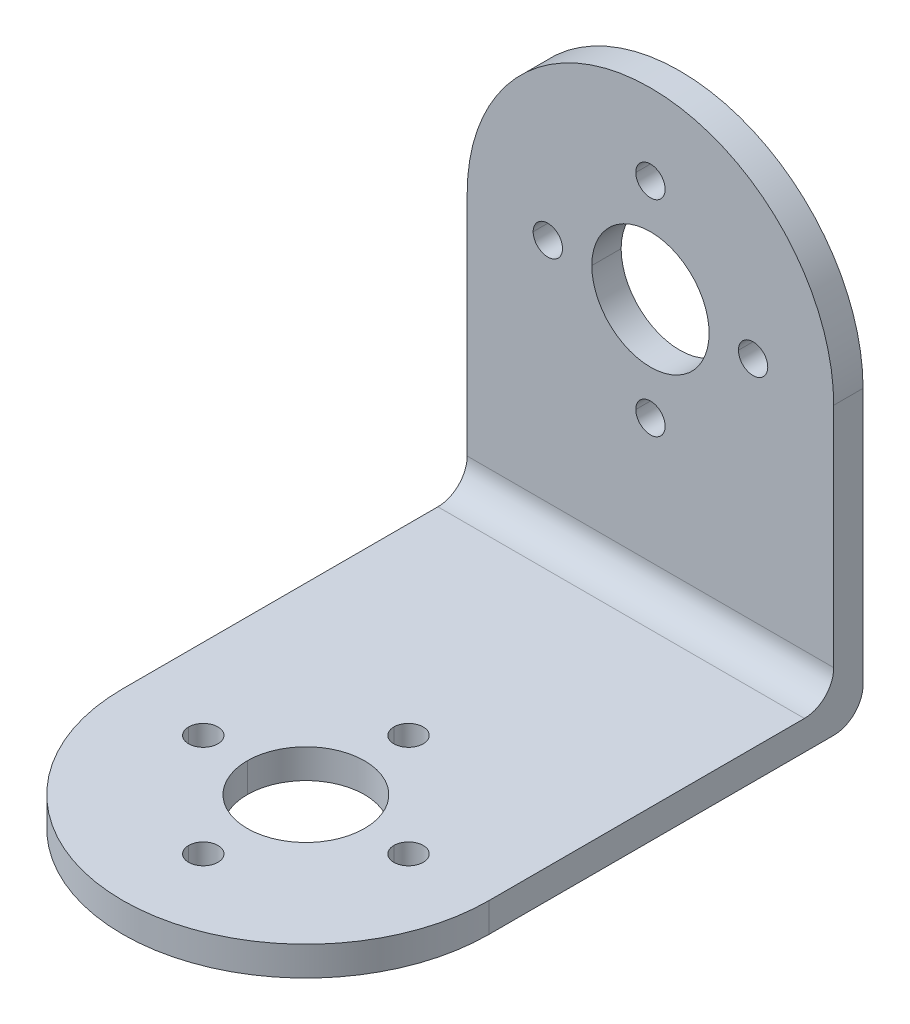
ISO-10303-21;
HEADER;
FILE_DESCRIPTION(('STEP AP214'),'2;1');
FILE_NAME('part.step','',(''),(''),'','','');
FILE_SCHEMA(('AUTOMOTIVE_DESIGN { 1 0 10303 214 1 1 1 1 }'));
ENDSEC;
DATA;
#1=APPLICATION_CONTEXT('core data for automotive mechanical design processes');
#2=APPLICATION_PROTOCOL_DEFINITION('international standard','automotive_design',2000,#1);
#3=PRODUCT_CONTEXT('',#1,'mechanical');
#4=PRODUCT('Part','Part','',(#3));
#5=PRODUCT_RELATED_PRODUCT_CATEGORY('part','',(#4));
#6=PRODUCT_DEFINITION_FORMATION('','',#4);
#7=PRODUCT_DEFINITION_CONTEXT('part definition',#1,'design');
#8=PRODUCT_DEFINITION('design','',#6,#7);
#9=PRODUCT_DEFINITION_SHAPE('','',#8);
#10=(LENGTH_UNIT() NAMED_UNIT(*) SI_UNIT(.MILLI.,.METRE.));
#11=(NAMED_UNIT(*) PLANE_ANGLE_UNIT() SI_UNIT($,.RADIAN.));
#12=(NAMED_UNIT(*) SI_UNIT($,.STERADIAN.) SOLID_ANGLE_UNIT());
#13=UNCERTAINTY_MEASURE_WITH_UNIT(LENGTH_MEASURE(1.E-05),#10,'distance_accuracy_value','');
#14=(GEOMETRIC_REPRESENTATION_CONTEXT(3) GLOBAL_UNCERTAINTY_ASSIGNED_CONTEXT((#13)) GLOBAL_UNIT_ASSIGNED_CONTEXT((#10,
#11,#12)) REPRESENTATION_CONTEXT('',''));
#15=CARTESIAN_POINT('',(0.,0.,0.));
#16=DIRECTION('',(0.,0.,1.));
#17=DIRECTION('',(1.,0.,0.));
#18=AXIS2_PLACEMENT_3D('',#15,#16,#17);
#19=CARTESIAN_POINT('',(0.,2.,2.));
#20=DIRECTION('',(1.,0.,0.));
#21=DIRECTION('',(0.,-1.,0.));
#22=AXIS2_PLACEMENT_3D('',#19,#20,#21);
#23=CYLINDRICAL_SURFACE('',#22,2.);
#24=CARTESIAN_POINT('',(-12.5,2.,2.));
#25=DIRECTION('',(1.,0.,0.));
#26=DIRECTION('',(0.,0.,1.));
#27=AXIS2_PLACEMENT_3D('',#24,#25,#26);
#28=CIRCLE('',#27,2.);
#29=CARTESIAN_POINT('',(-12.5,0.,2.));
#30=VERTEX_POINT('',#29);
#31=CARTESIAN_POINT('',(-12.5,2.,0.));
#32=VERTEX_POINT('',#31);
#33=EDGE_CURVE('E10',#30,#32,#28,.T.);
#34=ORIENTED_EDGE('',*,*,#33,.T.);
#35=DIRECTION('',(-1.,0.,0.));
#36=VECTOR('',#35,1.);
#37=CARTESIAN_POINT('',(0.,2.,0.));
#38=LINE('',#37,#36);
#39=CARTESIAN_POINT('',(12.5,2.,0.));
#40=VERTEX_POINT('',#39);
#41=EDGE_CURVE('E152',#40,#32,#38,.T.);
#42=ORIENTED_EDGE('',*,*,#41,.F.);
#43=CARTESIAN_POINT('',(12.5,2.,2.));
#44=DIRECTION('',(-1.,0.,0.));
#45=DIRECTION('',(0.,0.,-1.));
#46=AXIS2_PLACEMENT_3D('',#43,#44,#45);
#47=CIRCLE('',#46,2.);
#48=CARTESIAN_POINT('',(12.5,0.,2.));
#49=VERTEX_POINT('',#48);
#50=EDGE_CURVE('E20',#40,#49,#47,.T.);
#51=ORIENTED_EDGE('',*,*,#50,.T.);
#52=DIRECTION('',(-1.,0.,0.));
#53=VECTOR('',#52,1.);
#54=CARTESIAN_POINT('',(0.,0.,2.));
#55=LINE('',#54,#53);
#56=EDGE_CURVE('E151',#49,#30,#55,.T.);
#57=ORIENTED_EDGE('',*,*,#56,.T.);
#58=EDGE_LOOP('',(#34,#42,#51,#57));
#59=FACE_BOUND('',#58,.T.);
#60=ADVANCED_FACE('F17',(#59),#23,.T.);
#61=CARTESIAN_POINT('',(-12.5,0.,0.));
#62=DIRECTION('',(-1.,0.,0.));
#63=DIRECTION('',(0.,0.,1.));
#64=AXIS2_PLACEMENT_3D('',#61,#62,#63);
#65=PLANE('',#64);
#66=DIRECTION('',(0.,0.,1.));
#67=VECTOR('',#66,1.);
#68=CARTESIAN_POINT('',(-12.5,0.,13.75));
#69=LINE('',#68,#67);
#70=CARTESIAN_POINT('',(-12.5,0.,25.5));
#71=VERTEX_POINT('',#70);
#72=EDGE_CURVE('E168',#30,#71,#69,.T.);
#73=ORIENTED_EDGE('',*,*,#72,.T.);
#74=DIRECTION('',(0.,1.,0.));
#75=VECTOR('',#74,1.);
#76=CARTESIAN_POINT('',(-12.5,1.,25.5));
#77=LINE('',#76,#75);
#78=CARTESIAN_POINT('',(-12.5,2.,25.5));
#79=VERTEX_POINT('',#78);
#80=EDGE_CURVE('E336',#71,#79,#77,.T.);
#81=ORIENTED_EDGE('',*,*,#80,.T.);
#82=DIRECTION('',(0.,0.,1.));
#83=VECTOR('',#82,1.);
#84=CARTESIAN_POINT('',(-12.5,2.,14.75));
#85=LINE('',#84,#83);
#86=CARTESIAN_POINT('',(-12.5,2.,4.));
#87=VERTEX_POINT('',#86);
#88=EDGE_CURVE('E409',#87,#79,#85,.T.);
#89=ORIENTED_EDGE('',*,*,#88,.F.);
#90=CARTESIAN_POINT('',(-12.5,4.,4.));
#91=DIRECTION('',(1.,0.,0.));
#92=DIRECTION('',(0.,0.,1.));
#93=AXIS2_PLACEMENT_3D('',#90,#91,#92);
#94=CIRCLE('',#93,2.);
#95=CARTESIAN_POINT('',(-12.5,4.,2.));
#96=VERTEX_POINT('',#95);
#97=EDGE_CURVE('E175',#87,#96,#94,.T.);
#98=ORIENTED_EDGE('',*,*,#97,.T.);
#99=DIRECTION('',(0.,1.,0.));
#100=VECTOR('',#99,1.);
#101=CARTESIAN_POINT('',(-12.5,11.75,2.));
#102=LINE('',#101,#100);
#103=CARTESIAN_POINT('',(-12.5,19.5,2.));
#104=VERTEX_POINT('',#103);
#105=EDGE_CURVE('E406',#96,#104,#102,.T.);
#106=ORIENTED_EDGE('',*,*,#105,.T.);
#107=DIRECTION('',(0.,0.,-1.));
#108=VECTOR('',#107,1.);
#109=CARTESIAN_POINT('',(-12.5,19.5,1.));
#110=LINE('',#109,#108);
#111=CARTESIAN_POINT('',(-12.5,19.5,0.));
#112=VERTEX_POINT('',#111);
#113=EDGE_CURVE('E203',#104,#112,#110,.T.);
#114=ORIENTED_EDGE('',*,*,#113,.T.);
#115=DIRECTION('',(0.,1.,0.));
#116=VECTOR('',#115,1.);
#117=CARTESIAN_POINT('',(-12.5,10.75,0.));
#118=LINE('',#117,#116);
#119=EDGE_CURVE('E187',#32,#112,#118,.T.);
#120=ORIENTED_EDGE('',*,*,#119,.F.);
#121=ORIENTED_EDGE('',*,*,#33,.F.);
#122=EDGE_LOOP('',(#73,#81,#89,#98,#106,#114,#120,#121));
#123=FACE_BOUND('',#122,.T.);
#124=ADVANCED_FACE('F201',(#123),#65,.T.);
#125=CARTESIAN_POINT('',(12.5,0.,25.5));
#126=DIRECTION('',(1.,0.,0.));
#127=DIRECTION('',(0.,0.,-1.));
#128=AXIS2_PLACEMENT_3D('',#125,#126,#127);
#129=PLANE('',#128);
#130=DIRECTION('',(0.,1.,0.));
#131=VECTOR('',#130,1.);
#132=CARTESIAN_POINT('',(12.5,10.75,0.));
#133=LINE('',#132,#131);
#134=CARTESIAN_POINT('',(12.5,19.5,0.));
#135=VERTEX_POINT('',#134);
#136=EDGE_CURVE('E188',#40,#135,#133,.T.);
#137=ORIENTED_EDGE('',*,*,#136,.T.);
#138=DIRECTION('',(0.,0.,-1.));
#139=VECTOR('',#138,1.);
#140=CARTESIAN_POINT('',(12.5,19.5,1.));
#141=LINE('',#140,#139);
#142=CARTESIAN_POINT('',(12.5,19.5,2.));
#143=VERTEX_POINT('',#142);
#144=EDGE_CURVE('E249',#143,#135,#141,.T.);
#145=ORIENTED_EDGE('',*,*,#144,.F.);
#146=DIRECTION('',(0.,1.,0.));
#147=VECTOR('',#146,1.);
#148=CARTESIAN_POINT('',(12.5,11.75,2.));
#149=LINE('',#148,#147);
#150=CARTESIAN_POINT('',(12.5,4.,2.));
#151=VERTEX_POINT('',#150);
#152=EDGE_CURVE('E248',#151,#143,#149,.T.);
#153=ORIENTED_EDGE('',*,*,#152,.F.);
#154=CARTESIAN_POINT('',(12.5,4.,4.));
#155=DIRECTION('',(-1.,0.,0.));
#156=DIRECTION('',(0.,0.,-1.));
#157=AXIS2_PLACEMENT_3D('',#154,#155,#156);
#158=CIRCLE('',#157,2.);
#159=CARTESIAN_POINT('',(12.5,2.,4.));
#160=VERTEX_POINT('',#159);
#161=EDGE_CURVE('E181',#151,#160,#158,.T.);
#162=ORIENTED_EDGE('',*,*,#161,.T.);
#163=DIRECTION('',(0.,0.,-1.));
#164=VECTOR('',#163,1.);
#165=CARTESIAN_POINT('',(12.5,2.,14.75));
#166=LINE('',#165,#164);
#167=CARTESIAN_POINT('',(12.5,2.,25.5));
#168=VERTEX_POINT('',#167);
#169=EDGE_CURVE('E265',#168,#160,#166,.T.);
#170=ORIENTED_EDGE('',*,*,#169,.F.);
#171=DIRECTION('',(0.,1.,0.));
#172=VECTOR('',#171,1.);
#173=CARTESIAN_POINT('',(12.5,1.,25.5));
#174=LINE('',#173,#172);
#175=CARTESIAN_POINT('',(12.5,0.,25.5));
#176=VERTEX_POINT('',#175);
#177=EDGE_CURVE('E163',#176,#168,#174,.T.);
#178=ORIENTED_EDGE('',*,*,#177,.F.);
#179=DIRECTION('',(0.,0.,-1.));
#180=VECTOR('',#179,1.);
#181=CARTESIAN_POINT('',(12.5,0.,13.75));
#182=LINE('',#181,#180);
#183=EDGE_CURVE('E157',#176,#49,#182,.T.);
#184=ORIENTED_EDGE('',*,*,#183,.T.);
#185=ORIENTED_EDGE('',*,*,#50,.F.);
#186=EDGE_LOOP('',(#137,#145,#153,#162,#170,#178,#184,#185));
#187=FACE_BOUND('',#186,.T.);
#188=ADVANCED_FACE('F159',(#187),#129,.T.);
#189=CARTESIAN_POINT('',(12.5,0.,0.));
#190=DIRECTION('',(0.,0.,-1.));
#191=DIRECTION('',(-1.,0.,0.));
#192=AXIS2_PLACEMENT_3D('',#189,#190,#191);
#193=PLANE('',#192);
#194=CARTESIAN_POINT('',(0.,19.5,0.));
#195=DIRECTION('',(0.,0.,-1.));
#196=DIRECTION('',(-1.,0.,0.));
#197=AXIS2_PLACEMENT_3D('',#194,#195,#196);
#198=CIRCLE('',#197,4.);
#199=CARTESIAN_POINT('',(-4.,19.5,0.));
#200=VERTEX_POINT('',#199);
#201=CARTESIAN_POINT('',(4.,19.5,0.));
#202=VERTEX_POINT('',#201);
#203=EDGE_CURVE('E367',#200,#202,#198,.T.);
#204=ORIENTED_EDGE('',*,*,#203,.F.);
#205=CARTESIAN_POINT('',(0.,19.5,0.));
#206=DIRECTION('',(0.,0.,-1.));
#207=DIRECTION('',(-1.,0.,0.));
#208=AXIS2_PLACEMENT_3D('',#205,#206,#207);
#209=CIRCLE('',#208,4.);
#210=EDGE_CURVE('E341',#202,#200,#209,.T.);
#211=ORIENTED_EDGE('',*,*,#210,.F.);
#212=EDGE_LOOP('',(#204,#211));
#213=FACE_BOUND('',#212,.T.);
#214=CARTESIAN_POINT('',(0.,26.5,0.));
#215=DIRECTION('',(0.,0.,-1.));
#216=DIRECTION('',(-1.,0.,0.));
#217=AXIS2_PLACEMENT_3D('',#214,#215,#216);
#218=CIRCLE('',#217,1.);
#219=CARTESIAN_POINT('',(-1.,26.5,0.));
#220=VERTEX_POINT('',#219);
#221=CARTESIAN_POINT('',(1.,26.5,0.));
#222=VERTEX_POINT('',#221);
#223=EDGE_CURVE('E283',#220,#222,#218,.T.);
#224=ORIENTED_EDGE('',*,*,#223,.F.);
#225=CARTESIAN_POINT('',(0.,26.5,0.));
#226=DIRECTION('',(0.,0.,-1.));
#227=DIRECTION('',(-1.,0.,0.));
#228=AXIS2_PLACEMENT_3D('',#225,#226,#227);
#229=CIRCLE('',#228,1.);
#230=EDGE_CURVE('E375',#222,#220,#229,.T.);
#231=ORIENTED_EDGE('',*,*,#230,.F.);
#232=EDGE_LOOP('',(#224,#231));
#233=FACE_BOUND('',#232,.T.);
#234=CARTESIAN_POINT('',(7.,19.5,0.));
#235=DIRECTION('',(0.,0.,-1.));
#236=DIRECTION('',(-1.,0.,0.));
#237=AXIS2_PLACEMENT_3D('',#234,#235,#236);
#238=CIRCLE('',#237,1.);
#239=CARTESIAN_POINT('',(6.,19.5,0.));
#240=VERTEX_POINT('',#239);
#241=CARTESIAN_POINT('',(8.,19.5,0.));
#242=VERTEX_POINT('',#241);
#243=EDGE_CURVE('E405',#240,#242,#238,.T.);
#244=ORIENTED_EDGE('',*,*,#243,.F.);
#245=CARTESIAN_POINT('',(7.,19.5,0.));
#246=DIRECTION('',(0.,0.,-1.));
#247=DIRECTION('',(-1.,0.,0.));
#248=AXIS2_PLACEMENT_3D('',#245,#246,#247);
#249=CIRCLE('',#248,1.);
#250=EDGE_CURVE('E323',#242,#240,#249,.T.);
#251=ORIENTED_EDGE('',*,*,#250,.F.);
#252=EDGE_LOOP('',(#244,#251));
#253=FACE_BOUND('',#252,.T.);
#254=CARTESIAN_POINT('',(-7.,19.5,0.));
#255=DIRECTION('',(0.,0.,-1.));
#256=DIRECTION('',(-1.,0.,0.));
#257=AXIS2_PLACEMENT_3D('',#254,#255,#256);
#258=CIRCLE('',#257,1.);
#259=CARTESIAN_POINT('',(-8.,19.5,0.));
#260=VERTEX_POINT('',#259);
#261=CARTESIAN_POINT('',(-6.,19.5,0.));
#262=VERTEX_POINT('',#261);
#263=EDGE_CURVE('E348',#260,#262,#258,.T.);
#264=ORIENTED_EDGE('',*,*,#263,.F.);
#265=CARTESIAN_POINT('',(-7.,19.5,0.));
#266=DIRECTION('',(0.,0.,-1.));
#267=DIRECTION('',(-1.,0.,0.));
#268=AXIS2_PLACEMENT_3D('',#265,#266,#267);
#269=CIRCLE('',#268,1.);
#270=EDGE_CURVE('E234',#262,#260,#269,.T.);
#271=ORIENTED_EDGE('',*,*,#270,.F.);
#272=EDGE_LOOP('',(#264,#271));
#273=FACE_BOUND('',#272,.T.);
#274=CARTESIAN_POINT('',(0.,12.5,0.));
#275=DIRECTION('',(0.,0.,-1.));
#276=DIRECTION('',(-1.,0.,0.));
#277=AXIS2_PLACEMENT_3D('',#274,#275,#276);
#278=CIRCLE('',#277,1.);
#279=CARTESIAN_POINT('',(-1.,12.5,0.));
#280=VERTEX_POINT('',#279);
#281=CARTESIAN_POINT('',(1.,12.5,0.));
#282=VERTEX_POINT('',#281);
#283=EDGE_CURVE('E440',#280,#282,#278,.T.);
#284=ORIENTED_EDGE('',*,*,#283,.F.);
#285=CARTESIAN_POINT('',(0.,12.5,0.));
#286=DIRECTION('',(0.,0.,-1.));
#287=DIRECTION('',(-1.,0.,0.));
#288=AXIS2_PLACEMENT_3D('',#285,#286,#287);
#289=CIRCLE('',#288,1.);
#290=EDGE_CURVE('E309',#282,#280,#289,.T.);
#291=ORIENTED_EDGE('',*,*,#290,.F.);
#292=EDGE_LOOP('',(#284,#291));
#293=FACE_BOUND('',#292,.T.);
#294=ORIENTED_EDGE('',*,*,#119,.T.);
#295=CARTESIAN_POINT('',(0.,19.5,0.));
#296=DIRECTION('',(0.,0.,-1.));
#297=DIRECTION('',(-1.,0.,0.));
#298=AXIS2_PLACEMENT_3D('',#295,#296,#297);
#299=CIRCLE('',#298,12.5);
#300=EDGE_CURVE('E421',#112,#135,#299,.T.);
#301=ORIENTED_EDGE('',*,*,#300,.T.);
#302=ORIENTED_EDGE('',*,*,#136,.F.);
#303=ORIENTED_EDGE('',*,*,#41,.T.);
#304=EDGE_LOOP('',(#294,#301,#302,#303));
#305=FACE_BOUND('',#304,.T.);
#306=ADVANCED_FACE('F196',(#213,#233,#253,#273,#293,#305),#193,.T.);
#307=CARTESIAN_POINT('',(0.,0.,0.));
#308=DIRECTION('',(0.,1.,0.));
#309=DIRECTION('',(-1.,0.,0.));
#310=AXIS2_PLACEMENT_3D('',#307,#308,#309);
#311=PLANE('',#310);
#312=CARTESIAN_POINT('',(0.,0.,32.5));
#313=DIRECTION('',(0.,1.,0.));
#314=DIRECTION('',(-1.,0.,0.));
#315=AXIS2_PLACEMENT_3D('',#312,#313,#314);
#316=CIRCLE('',#315,1.);
#317=CARTESIAN_POINT('',(-1.,0.,32.5));
#318=VERTEX_POINT('',#317);
#319=CARTESIAN_POINT('',(1.,0.,32.5));
#320=VERTEX_POINT('',#319);
#321=EDGE_CURVE('E620',#318,#320,#316,.T.);
#322=ORIENTED_EDGE('',*,*,#321,.T.);
#323=CARTESIAN_POINT('',(0.,0.,32.5));
#324=DIRECTION('',(0.,1.,0.));
#325=DIRECTION('',(-1.,0.,0.));
#326=AXIS2_PLACEMENT_3D('',#323,#324,#325);
#327=CIRCLE('',#326,1.);
#328=EDGE_CURVE('E217',#320,#318,#327,.T.);
#329=ORIENTED_EDGE('',*,*,#328,.T.);
#330=EDGE_LOOP('',(#322,#329));
#331=FACE_BOUND('',#330,.T.);
#332=CARTESIAN_POINT('',(0.,0.,18.5));
#333=DIRECTION('',(0.,1.,0.));
#334=DIRECTION('',(-1.,0.,0.));
#335=AXIS2_PLACEMENT_3D('',#332,#333,#334);
#336=CIRCLE('',#335,1.);
#337=CARTESIAN_POINT('',(-1.,0.,18.5));
#338=VERTEX_POINT('',#337);
#339=CARTESIAN_POINT('',(1.,0.,18.5));
#340=VERTEX_POINT('',#339);
#341=EDGE_CURVE('E211',#338,#340,#336,.T.);
#342=ORIENTED_EDGE('',*,*,#341,.T.);
#343=CARTESIAN_POINT('',(0.,0.,18.5));
#344=DIRECTION('',(0.,1.,0.));
#345=DIRECTION('',(-1.,0.,0.));
#346=AXIS2_PLACEMENT_3D('',#343,#344,#345);
#347=CIRCLE('',#346,1.);
#348=EDGE_CURVE('E254',#340,#338,#347,.T.);
#349=ORIENTED_EDGE('',*,*,#348,.T.);
#350=EDGE_LOOP('',(#342,#349));
#351=FACE_BOUND('',#350,.T.);
#352=CARTESIAN_POINT('',(7.,0.,25.5));
#353=DIRECTION('',(0.,1.,0.));
#354=DIRECTION('',(-1.,0.,0.));
#355=AXIS2_PLACEMENT_3D('',#352,#353,#354);
#356=CIRCLE('',#355,1.);
#357=CARTESIAN_POINT('',(6.,0.,25.5));
#358=VERTEX_POINT('',#357);
#359=CARTESIAN_POINT('',(8.,0.,25.5));
#360=VERTEX_POINT('',#359);
#361=EDGE_CURVE('E226',#358,#360,#356,.T.);
#362=ORIENTED_EDGE('',*,*,#361,.T.);
#363=CARTESIAN_POINT('',(7.,0.,25.5));
#364=DIRECTION('',(0.,1.,0.));
#365=DIRECTION('',(-1.,0.,0.));
#366=AXIS2_PLACEMENT_3D('',#363,#364,#365);
#367=CIRCLE('',#366,1.);
#368=EDGE_CURVE('E270',#360,#358,#367,.T.);
#369=ORIENTED_EDGE('',*,*,#368,.T.);
#370=EDGE_LOOP('',(#362,#369));
#371=FACE_BOUND('',#370,.T.);
#372=CARTESIAN_POINT('',(-7.,0.,25.5));
#373=DIRECTION('',(0.,1.,0.));
#374=DIRECTION('',(-1.,0.,0.));
#375=AXIS2_PLACEMENT_3D('',#372,#373,#374);
#376=CIRCLE('',#375,1.);
#377=CARTESIAN_POINT('',(-8.,0.,25.5));
#378=VERTEX_POINT('',#377);
#379=CARTESIAN_POINT('',(-6.,0.,25.5));
#380=VERTEX_POINT('',#379);
#381=EDGE_CURVE('E282',#378,#380,#376,.T.);
#382=ORIENTED_EDGE('',*,*,#381,.T.);
#383=CARTESIAN_POINT('',(-7.,0.,25.5));
#384=DIRECTION('',(0.,1.,0.));
#385=DIRECTION('',(-1.,0.,0.));
#386=AXIS2_PLACEMENT_3D('',#383,#384,#385);
#387=CIRCLE('',#386,1.);
#388=EDGE_CURVE('E299',#380,#378,#387,.T.);
#389=ORIENTED_EDGE('',*,*,#388,.T.);
#390=EDGE_LOOP('',(#382,#389));
#391=FACE_BOUND('',#390,.T.);
#392=CARTESIAN_POINT('',(0.,0.,25.5));
#393=DIRECTION('',(0.,1.,0.));
#394=DIRECTION('',(-1.,0.,0.));
#395=AXIS2_PLACEMENT_3D('',#392,#393,#394);
#396=CIRCLE('',#395,4.);
#397=CARTESIAN_POINT('',(-4.,0.,25.5));
#398=VERTEX_POINT('',#397);
#399=CARTESIAN_POINT('',(4.,0.,25.5));
#400=VERTEX_POINT('',#399);
#401=EDGE_CURVE('E319',#398,#400,#396,.T.);
#402=ORIENTED_EDGE('',*,*,#401,.T.);
#403=CARTESIAN_POINT('',(0.,0.,25.5));
#404=DIRECTION('',(0.,1.,0.));
#405=DIRECTION('',(-1.,0.,0.));
#406=AXIS2_PLACEMENT_3D('',#403,#404,#405);
#407=CIRCLE('',#406,4.);
#408=EDGE_CURVE('E332',#400,#398,#407,.T.);
#409=ORIENTED_EDGE('',*,*,#408,.T.);
#410=EDGE_LOOP('',(#402,#409));
#411=FACE_BOUND('',#410,.T.);
#412=ORIENTED_EDGE('',*,*,#56,.F.);
#413=ORIENTED_EDGE('',*,*,#183,.F.);
#414=CARTESIAN_POINT('',(0.,0.,25.5));
#415=DIRECTION('',(0.,1.,0.));
#416=DIRECTION('',(-1.,0.,0.));
#417=AXIS2_PLACEMENT_3D('',#414,#415,#416);
#418=CIRCLE('',#417,12.5);
#419=EDGE_CURVE('E345',#71,#176,#418,.T.);
#420=ORIENTED_EDGE('',*,*,#419,.F.);
#421=ORIENTED_EDGE('',*,*,#72,.F.);
#422=EDGE_LOOP('',(#412,#413,#420,#421));
#423=FACE_BOUND('',#422,.T.);
#424=ADVANCED_FACE('F172',(#331,#351,#371,#391,#411,#423),#311,.F.);
#425=CARTESIAN_POINT('',(0.,4.,4.));
#426=DIRECTION('',(1.,0.,0.));
#427=DIRECTION('',(0.,-1.,0.));
#428=AXIS2_PLACEMENT_3D('',#425,#426,#427);
#429=CYLINDRICAL_SURFACE('',#428,2.);
#430=DIRECTION('',(-1.,0.,0.));
#431=VECTOR('',#430,1.);
#432=CARTESIAN_POINT('',(0.,2.,4.));
#433=LINE('',#432,#431);
#434=EDGE_CURVE('E261',#160,#87,#433,.T.);
#435=ORIENTED_EDGE('',*,*,#434,.F.);
#436=ORIENTED_EDGE('',*,*,#161,.F.);
#437=DIRECTION('',(-1.,0.,0.));
#438=VECTOR('',#437,1.);
#439=CARTESIAN_POINT('',(0.,4.,2.));
#440=LINE('',#439,#438);
#441=EDGE_CURVE('E244',#151,#96,#440,.T.);
#442=ORIENTED_EDGE('',*,*,#441,.T.);
#443=ORIENTED_EDGE('',*,*,#97,.F.);
#444=EDGE_LOOP('',(#435,#436,#442,#443));
#445=FACE_BOUND('',#444,.T.);
#446=ADVANCED_FACE('F589',(#445),#429,.F.);
#447=CARTESIAN_POINT('',(0.,2.,0.));
#448=DIRECTION('',(0.,1.,0.));
#449=DIRECTION('',(-1.,0.,0.));
#450=AXIS2_PLACEMENT_3D('',#447,#448,#449);
#451=PLANE('',#450);
#452=CARTESIAN_POINT('',(0.,2.,32.5));
#453=DIRECTION('',(0.,1.,0.));
#454=DIRECTION('',(-1.,0.,0.));
#455=AXIS2_PLACEMENT_3D('',#452,#453,#454);
#456=CIRCLE('',#455,1.);
#457=CARTESIAN_POINT('',(1.,2.,32.5));
#458=VERTEX_POINT('',#457);
#459=CARTESIAN_POINT('',(-1.,2.,32.5));
#460=VERTEX_POINT('',#459);
#461=EDGE_CURVE('E213',#458,#460,#456,.T.);
#462=ORIENTED_EDGE('',*,*,#461,.F.);
#463=CARTESIAN_POINT('',(0.,2.,32.5));
#464=DIRECTION('',(0.,1.,0.));
#465=DIRECTION('',(-1.,0.,0.));
#466=AXIS2_PLACEMENT_3D('',#463,#464,#465);
#467=CIRCLE('',#466,1.);
#468=EDGE_CURVE('E611',#460,#458,#467,.T.);
#469=ORIENTED_EDGE('',*,*,#468,.F.);
#470=EDGE_LOOP('',(#462,#469));
#471=FACE_BOUND('',#470,.T.);
#472=CARTESIAN_POINT('',(0.,2.,18.5));
#473=DIRECTION('',(0.,1.,0.));
#474=DIRECTION('',(-1.,0.,0.));
#475=AXIS2_PLACEMENT_3D('',#472,#473,#474);
#476=CIRCLE('',#475,1.);
#477=CARTESIAN_POINT('',(1.,2.,18.5));
#478=VERTEX_POINT('',#477);
#479=CARTESIAN_POINT('',(-1.,2.,18.5));
#480=VERTEX_POINT('',#479);
#481=EDGE_CURVE('E233',#478,#480,#476,.T.);
#482=ORIENTED_EDGE('',*,*,#481,.F.);
#483=CARTESIAN_POINT('',(0.,2.,18.5));
#484=DIRECTION('',(0.,1.,0.));
#485=DIRECTION('',(-1.,0.,0.));
#486=AXIS2_PLACEMENT_3D('',#483,#484,#485);
#487=CIRCLE('',#486,1.);
#488=EDGE_CURVE('E222',#480,#478,#487,.T.);
#489=ORIENTED_EDGE('',*,*,#488,.F.);
#490=EDGE_LOOP('',(#482,#489));
#491=FACE_BOUND('',#490,.T.);
#492=CARTESIAN_POINT('',(7.,2.,25.5));
#493=DIRECTION('',(0.,1.,0.));
#494=DIRECTION('',(-1.,0.,0.));
#495=AXIS2_PLACEMENT_3D('',#492,#493,#494);
#496=CIRCLE('',#495,1.);
#497=CARTESIAN_POINT('',(8.,2.,25.5));
#498=VERTEX_POINT('',#497);
#499=CARTESIAN_POINT('',(6.,2.,25.5));
#500=VERTEX_POINT('',#499);
#501=EDGE_CURVE('E266',#498,#500,#496,.T.);
#502=ORIENTED_EDGE('',*,*,#501,.F.);
#503=CARTESIAN_POINT('',(7.,2.,25.5));
#504=DIRECTION('',(0.,1.,0.));
#505=DIRECTION('',(-1.,0.,0.));
#506=AXIS2_PLACEMENT_3D('',#503,#504,#505);
#507=CIRCLE('',#506,1.);
#508=EDGE_CURVE('E227',#500,#498,#507,.T.);
#509=ORIENTED_EDGE('',*,*,#508,.F.);
#510=EDGE_LOOP('',(#502,#509));
#511=FACE_BOUND('',#510,.T.);
#512=CARTESIAN_POINT('',(-7.,2.,25.5));
#513=DIRECTION('',(0.,1.,0.));
#514=DIRECTION('',(-1.,0.,0.));
#515=AXIS2_PLACEMENT_3D('',#512,#513,#514);
#516=CIRCLE('',#515,1.);
#517=CARTESIAN_POINT('',(-6.,2.,25.5));
#518=VERTEX_POINT('',#517);
#519=CARTESIAN_POINT('',(-8.,2.,25.5));
#520=VERTEX_POINT('',#519);
#521=EDGE_CURVE('E295',#518,#520,#516,.T.);
#522=ORIENTED_EDGE('',*,*,#521,.F.);
#523=CARTESIAN_POINT('',(-7.,2.,25.5));
#524=DIRECTION('',(0.,1.,0.));
#525=DIRECTION('',(-1.,0.,0.));
#526=AXIS2_PLACEMENT_3D('',#523,#524,#525);
#527=CIRCLE('',#526,1.);
#528=EDGE_CURVE('E274',#520,#518,#527,.T.);
#529=ORIENTED_EDGE('',*,*,#528,.F.);
#530=EDGE_LOOP('',(#522,#529));
#531=FACE_BOUND('',#530,.T.);
#532=CARTESIAN_POINT('',(0.,2.,25.5));
#533=DIRECTION('',(0.,1.,0.));
#534=DIRECTION('',(-1.,0.,0.));
#535=AXIS2_PLACEMENT_3D('',#532,#533,#534);
#536=CIRCLE('',#535,4.);
#537=CARTESIAN_POINT('',(4.,2.,25.5));
#538=VERTEX_POINT('',#537);
#539=CARTESIAN_POINT('',(-4.,2.,25.5));
#540=VERTEX_POINT('',#539);
#541=EDGE_CURVE('E328',#538,#540,#536,.T.);
#542=ORIENTED_EDGE('',*,*,#541,.F.);
#543=CARTESIAN_POINT('',(0.,2.,25.5));
#544=DIRECTION('',(0.,1.,0.));
#545=DIRECTION('',(-1.,0.,0.));
#546=AXIS2_PLACEMENT_3D('',#543,#544,#545);
#547=CIRCLE('',#546,4.);
#548=EDGE_CURVE('E303',#540,#538,#547,.T.);
#549=ORIENTED_EDGE('',*,*,#548,.F.);
#550=EDGE_LOOP('',(#542,#549));
#551=FACE_BOUND('',#550,.T.);
#552=ORIENTED_EDGE('',*,*,#88,.T.);
#553=CARTESIAN_POINT('',(0.,2.,25.5));
#554=DIRECTION('',(0.,1.,0.));
#555=DIRECTION('',(-1.,0.,0.));
#556=AXIS2_PLACEMENT_3D('',#553,#554,#555);
#557=CIRCLE('',#556,12.5);
#558=EDGE_CURVE('E337',#79,#168,#557,.T.);
#559=ORIENTED_EDGE('',*,*,#558,.T.);
#560=ORIENTED_EDGE('',*,*,#169,.T.);
#561=ORIENTED_EDGE('',*,*,#434,.T.);
#562=EDGE_LOOP('',(#552,#559,#560,#561));
#563=FACE_BOUND('',#562,.T.);
#564=ADVANCED_FACE('F464',(#471,#491,#511,#531,#551,#563),#451,.T.);
#565=CARTESIAN_POINT('',(12.5,2.,2.));
#566=DIRECTION('',(0.,0.,-1.));
#567=DIRECTION('',(-1.,0.,0.));
#568=AXIS2_PLACEMENT_3D('',#565,#566,#567);
#569=PLANE('',#568);
#570=CARTESIAN_POINT('',(0.,19.5,2.));
#571=DIRECTION('',(0.,0.,1.));
#572=DIRECTION('',(1.,0.,0.));
#573=AXIS2_PLACEMENT_3D('',#570,#571,#572);
#574=CIRCLE('',#573,4.);
#575=CARTESIAN_POINT('',(-4.,19.5,2.));
#576=VERTEX_POINT('',#575);
#577=CARTESIAN_POINT('',(4.,19.5,2.));
#578=VERTEX_POINT('',#577);
#579=EDGE_CURVE('E359',#576,#578,#574,.T.);
#580=ORIENTED_EDGE('',*,*,#579,.F.);
#581=CARTESIAN_POINT('',(0.,19.5,2.));
#582=DIRECTION('',(0.,0.,1.));
#583=DIRECTION('',(1.,0.,0.));
#584=AXIS2_PLACEMENT_3D('',#581,#582,#583);
#585=CIRCLE('',#584,4.);
#586=EDGE_CURVE('E371',#578,#576,#585,.T.);
#587=ORIENTED_EDGE('',*,*,#586,.F.);
#588=EDGE_LOOP('',(#580,#587));
#589=FACE_BOUND('',#588,.T.);
#590=CARTESIAN_POINT('',(0.,26.5,2.));
#591=DIRECTION('',(0.,0.,1.));
#592=DIRECTION('',(1.,0.,0.));
#593=AXIS2_PLACEMENT_3D('',#590,#591,#592);
#594=CIRCLE('',#593,1.);
#595=CARTESIAN_POINT('',(-1.,26.5,2.));
#596=VERTEX_POINT('',#595);
#597=CARTESIAN_POINT('',(1.,26.5,2.));
#598=VERTEX_POINT('',#597);
#599=EDGE_CURVE('E383',#596,#598,#594,.T.);
#600=ORIENTED_EDGE('',*,*,#599,.F.);
#601=CARTESIAN_POINT('',(0.,26.5,2.));
#602=DIRECTION('',(0.,0.,1.));
#603=DIRECTION('',(1.,0.,0.));
#604=AXIS2_PLACEMENT_3D('',#601,#602,#603);
#605=CIRCLE('',#604,1.);
#606=EDGE_CURVE('E286',#598,#596,#605,.T.);
#607=ORIENTED_EDGE('',*,*,#606,.F.);
#608=EDGE_LOOP('',(#600,#607));
#609=FACE_BOUND('',#608,.T.);
#610=CARTESIAN_POINT('',(7.,19.5,2.));
#611=DIRECTION('',(0.,0.,1.));
#612=DIRECTION('',(1.,0.,0.));
#613=AXIS2_PLACEMENT_3D('',#610,#611,#612);
#614=CIRCLE('',#613,1.);
#615=CARTESIAN_POINT('',(6.,19.5,2.));
#616=VERTEX_POINT('',#615);
#617=CARTESIAN_POINT('',(8.,19.5,2.));
#618=VERTEX_POINT('',#617);
#619=EDGE_CURVE('E397',#616,#618,#614,.T.);
#620=ORIENTED_EDGE('',*,*,#619,.F.);
#621=CARTESIAN_POINT('',(7.,19.5,2.));
#622=DIRECTION('',(0.,0.,1.));
#623=DIRECTION('',(1.,0.,0.));
#624=AXIS2_PLACEMENT_3D('',#621,#622,#623);
#625=CIRCLE('',#624,1.);
#626=EDGE_CURVE('E239',#618,#616,#625,.T.);
#627=ORIENTED_EDGE('',*,*,#626,.F.);
#628=EDGE_LOOP('',(#620,#627));
#629=FACE_BOUND('',#628,.T.);
#630=CARTESIAN_POINT('',(-7.,19.5,2.));
#631=DIRECTION('',(0.,0.,1.));
#632=DIRECTION('',(1.,0.,0.));
#633=AXIS2_PLACEMENT_3D('',#630,#631,#632);
#634=CIRCLE('',#633,1.);
#635=CARTESIAN_POINT('',(-8.,19.5,2.));
#636=VERTEX_POINT('',#635);
#637=CARTESIAN_POINT('',(-6.,19.5,2.));
#638=VERTEX_POINT('',#637);
#639=EDGE_CURVE('E417',#636,#638,#634,.T.);
#640=ORIENTED_EDGE('',*,*,#639,.F.);
#641=CARTESIAN_POINT('',(-7.,19.5,2.));
#642=DIRECTION('',(0.,0.,1.));
#643=DIRECTION('',(1.,0.,0.));
#644=AXIS2_PLACEMENT_3D('',#641,#642,#643);
#645=CIRCLE('',#644,1.);
#646=EDGE_CURVE('E351',#638,#636,#645,.T.);
#647=ORIENTED_EDGE('',*,*,#646,.F.);
#648=EDGE_LOOP('',(#640,#647));
#649=FACE_BOUND('',#648,.T.);
#650=CARTESIAN_POINT('',(0.,12.5,2.));
#651=DIRECTION('',(0.,0.,1.));
#652=DIRECTION('',(1.,0.,0.));
#653=AXIS2_PLACEMENT_3D('',#650,#651,#652);
#654=CIRCLE('',#653,1.);
#655=CARTESIAN_POINT('',(-1.,12.5,2.));
#656=VERTEX_POINT('',#655);
#657=CARTESIAN_POINT('',(1.,12.5,2.));
#658=VERTEX_POINT('',#657);
#659=EDGE_CURVE('E308',#656,#658,#654,.T.);
#660=ORIENTED_EDGE('',*,*,#659,.F.);
#661=CARTESIAN_POINT('',(0.,12.5,2.));
#662=DIRECTION('',(0.,0.,1.));
#663=DIRECTION('',(1.,0.,0.));
#664=AXIS2_PLACEMENT_3D('',#661,#662,#663);
#665=CIRCLE('',#664,1.);
#666=EDGE_CURVE('E424',#658,#656,#665,.T.);
#667=ORIENTED_EDGE('',*,*,#666,.F.);
#668=EDGE_LOOP('',(#660,#667));
#669=FACE_BOUND('',#668,.T.);
#670=ORIENTED_EDGE('',*,*,#441,.F.);
#671=ORIENTED_EDGE('',*,*,#152,.T.);
#672=CARTESIAN_POINT('',(0.,19.5,2.));
#673=DIRECTION('',(0.,0.,-1.));
#674=DIRECTION('',(1.,0.,0.));
#675=AXIS2_PLACEMENT_3D('',#672,#673,#674);
#676=CIRCLE('',#675,12.5);
#677=EDGE_CURVE('E447',#104,#143,#676,.T.);
#678=ORIENTED_EDGE('',*,*,#677,.F.);
#679=ORIENTED_EDGE('',*,*,#105,.F.);
#680=EDGE_LOOP('',(#670,#671,#678,#679));
#681=FACE_BOUND('',#680,.T.);
#682=ADVANCED_FACE('F588',(#589,#609,#629,#649,#669,#681),#569,.F.);
#683=CARTESIAN_POINT('',(0.,19.5,0.339999999774993));
#684=DIRECTION('',(0.,0.,-1.));
#685=DIRECTION('',(1.,0.,0.));
#686=AXIS2_PLACEMENT_3D('',#683,#684,#685);
#687=CYLINDRICAL_SURFACE('',#686,12.5);
#688=ORIENTED_EDGE('',*,*,#300,.F.);
#689=ORIENTED_EDGE('',*,*,#113,.F.);
#690=ORIENTED_EDGE('',*,*,#677,.T.);
#691=ORIENTED_EDGE('',*,*,#144,.T.);
#692=EDGE_LOOP('',(#688,#689,#690,#691));
#693=FACE_BOUND('',#692,.T.);
#694=ADVANCED_FACE('F1277',(#693),#687,.T.);
#695=CARTESIAN_POINT('',(0.,12.5,0.339999999774993));
#696=DIRECTION('',(0.,0.,-1.));
#697=DIRECTION('',(1.,0.,0.));
#698=AXIS2_PLACEMENT_3D('',#695,#696,#697);
#699=CYLINDRICAL_SURFACE('',#698,1.);
#700=ORIENTED_EDGE('',*,*,#283,.T.);
#701=DIRECTION('',(0.,0.,-1.));
#702=VECTOR('',#701,1.);
#703=CARTESIAN_POINT('',(1.,12.5,0.339999999774993));
#704=LINE('',#703,#702);
#705=EDGE_CURVE('E436',#658,#282,#704,.T.);
#706=ORIENTED_EDGE('',*,*,#705,.F.);
#707=ORIENTED_EDGE('',*,*,#666,.T.);
#708=DIRECTION('',(0.,0.,-1.));
#709=VECTOR('',#708,1.);
#710=CARTESIAN_POINT('',(-1.,12.5,0.339999999774993));
#711=LINE('',#710,#709);
#712=EDGE_CURVE('E304',#656,#280,#711,.T.);
#713=ORIENTED_EDGE('',*,*,#712,.T.);
#714=EDGE_LOOP('',(#700,#706,#707,#713));
#715=FACE_BOUND('',#714,.T.);
#716=ADVANCED_FACE('F1265',(#715),#699,.F.);
#717=CARTESIAN_POINT('',(0.,12.5,0.339999999774993));
#718=DIRECTION('',(0.,0.,-1.));
#719=DIRECTION('',(1.,0.,0.));
#720=AXIS2_PLACEMENT_3D('',#717,#718,#719);
#721=CYLINDRICAL_SURFACE('',#720,1.);
#722=ORIENTED_EDGE('',*,*,#290,.T.);
#723=ORIENTED_EDGE('',*,*,#712,.F.);
#724=ORIENTED_EDGE('',*,*,#659,.T.);
#725=ORIENTED_EDGE('',*,*,#705,.T.);
#726=EDGE_LOOP('',(#722,#723,#724,#725));
#727=FACE_BOUND('',#726,.T.);
#728=ADVANCED_FACE('F1253',(#727),#721,.F.);
#729=CARTESIAN_POINT('',(-7.,19.5,0.339999999774993));
#730=DIRECTION('',(0.,0.,-1.));
#731=DIRECTION('',(1.,0.,0.));
#732=AXIS2_PLACEMENT_3D('',#729,#730,#731);
#733=CYLINDRICAL_SURFACE('',#732,1.);
#734=ORIENTED_EDGE('',*,*,#263,.T.);
#735=DIRECTION('',(0.,0.,-1.));
#736=VECTOR('',#735,1.);
#737=CARTESIAN_POINT('',(-6.,19.5,0.339999999774993));
#738=LINE('',#737,#736);
#739=EDGE_CURVE('E352',#638,#262,#738,.T.);
#740=ORIENTED_EDGE('',*,*,#739,.F.);
#741=ORIENTED_EDGE('',*,*,#646,.T.);
#742=DIRECTION('',(0.,0.,-1.));
#743=VECTOR('',#742,1.);
#744=CARTESIAN_POINT('',(-8.,19.5,0.339999999774993));
#745=LINE('',#744,#743);
#746=EDGE_CURVE('E238',#636,#260,#745,.T.);
#747=ORIENTED_EDGE('',*,*,#746,.T.);
#748=EDGE_LOOP('',(#734,#740,#741,#747));
#749=FACE_BOUND('',#748,.T.);
#750=ADVANCED_FACE('F1241',(#749),#733,.F.);
#751=CARTESIAN_POINT('',(-7.,19.5,0.339999999774993));
#752=DIRECTION('',(0.,0.,-1.));
#753=DIRECTION('',(1.,0.,0.));
#754=AXIS2_PLACEMENT_3D('',#751,#752,#753);
#755=CYLINDRICAL_SURFACE('',#754,1.);
#756=ORIENTED_EDGE('',*,*,#270,.T.);
#757=ORIENTED_EDGE('',*,*,#746,.F.);
#758=ORIENTED_EDGE('',*,*,#639,.T.);
#759=ORIENTED_EDGE('',*,*,#739,.T.);
#760=EDGE_LOOP('',(#756,#757,#758,#759));
#761=FACE_BOUND('',#760,.T.);
#762=ADVANCED_FACE('F1229',(#761),#755,.F.);
#763=CARTESIAN_POINT('',(7.,19.5,0.339999999774993));
#764=DIRECTION('',(0.,0.,-1.));
#765=DIRECTION('',(1.,0.,0.));
#766=AXIS2_PLACEMENT_3D('',#763,#764,#765);
#767=CYLINDRICAL_SURFACE('',#766,1.);
#768=ORIENTED_EDGE('',*,*,#243,.T.);
#769=DIRECTION('',(0.,0.,-1.));
#770=VECTOR('',#769,1.);
#771=CARTESIAN_POINT('',(8.,19.5,0.339999999774993));
#772=LINE('',#771,#770);
#773=EDGE_CURVE('E401',#618,#242,#772,.T.);
#774=ORIENTED_EDGE('',*,*,#773,.F.);
#775=ORIENTED_EDGE('',*,*,#626,.T.);
#776=DIRECTION('',(0.,0.,-1.));
#777=VECTOR('',#776,1.);
#778=CARTESIAN_POINT('',(6.,19.5,0.339999999774993));
#779=LINE('',#778,#777);
#780=EDGE_CURVE('E393',#616,#240,#779,.T.);
#781=ORIENTED_EDGE('',*,*,#780,.T.);
#782=EDGE_LOOP('',(#768,#774,#775,#781));
#783=FACE_BOUND('',#782,.T.);
#784=ADVANCED_FACE('F1133',(#783),#767,.F.);
#785=CARTESIAN_POINT('',(7.,19.5,0.339999999774993));
#786=DIRECTION('',(0.,0.,-1.));
#787=DIRECTION('',(1.,0.,0.));
#788=AXIS2_PLACEMENT_3D('',#785,#786,#787);
#789=CYLINDRICAL_SURFACE('',#788,1.);
#790=ORIENTED_EDGE('',*,*,#250,.T.);
#791=ORIENTED_EDGE('',*,*,#780,.F.);
#792=ORIENTED_EDGE('',*,*,#619,.T.);
#793=ORIENTED_EDGE('',*,*,#773,.T.);
#794=EDGE_LOOP('',(#790,#791,#792,#793));
#795=FACE_BOUND('',#794,.T.);
#796=ADVANCED_FACE('F1127',(#795),#789,.F.);
#797=CARTESIAN_POINT('',(0.,26.5,0.339999999774993));
#798=DIRECTION('',(0.,0.,-1.));
#799=DIRECTION('',(1.,0.,0.));
#800=AXIS2_PLACEMENT_3D('',#797,#798,#799);
#801=CYLINDRICAL_SURFACE('',#800,1.);
#802=ORIENTED_EDGE('',*,*,#223,.T.);
#803=DIRECTION('',(0.,0.,-1.));
#804=VECTOR('',#803,1.);
#805=CARTESIAN_POINT('',(1.,26.5,0.339999999774993));
#806=LINE('',#805,#804);
#807=EDGE_CURVE('E287',#598,#222,#806,.T.);
#808=ORIENTED_EDGE('',*,*,#807,.F.);
#809=ORIENTED_EDGE('',*,*,#606,.T.);
#810=DIRECTION('',(0.,0.,-1.));
#811=VECTOR('',#810,1.);
#812=CARTESIAN_POINT('',(-1.,26.5,0.339999999774993));
#813=LINE('',#812,#811);
#814=EDGE_CURVE('E379',#596,#220,#813,.T.);
#815=ORIENTED_EDGE('',*,*,#814,.T.);
#816=EDGE_LOOP('',(#802,#808,#809,#815));
#817=FACE_BOUND('',#816,.T.);
#818=ADVANCED_FACE('F1132',(#817),#801,.F.);
#819=CARTESIAN_POINT('',(0.,26.5,0.339999999774993));
#820=DIRECTION('',(0.,0.,-1.));
#821=DIRECTION('',(1.,0.,0.));
#822=AXIS2_PLACEMENT_3D('',#819,#820,#821);
#823=CYLINDRICAL_SURFACE('',#822,1.);
#824=ORIENTED_EDGE('',*,*,#230,.T.);
#825=ORIENTED_EDGE('',*,*,#814,.F.);
#826=ORIENTED_EDGE('',*,*,#599,.T.);
#827=ORIENTED_EDGE('',*,*,#807,.T.);
#828=EDGE_LOOP('',(#824,#825,#826,#827));
#829=FACE_BOUND('',#828,.T.);
#830=ADVANCED_FACE('F1194',(#829),#823,.F.);
#831=CARTESIAN_POINT('',(0.,19.5,0.339999999774993));
#832=DIRECTION('',(0.,0.,-1.));
#833=DIRECTION('',(1.,0.,0.));
#834=AXIS2_PLACEMENT_3D('',#831,#832,#833);
#835=CYLINDRICAL_SURFACE('',#834,4.);
#836=ORIENTED_EDGE('',*,*,#203,.T.);
#837=DIRECTION('',(0.,0.,-1.));
#838=VECTOR('',#837,1.);
#839=CARTESIAN_POINT('',(4.,19.5,0.339999999774993));
#840=LINE('',#839,#838);
#841=EDGE_CURVE('E363',#578,#202,#840,.T.);
#842=ORIENTED_EDGE('',*,*,#841,.F.);
#843=ORIENTED_EDGE('',*,*,#586,.T.);
#844=DIRECTION('',(0.,0.,-1.));
#845=VECTOR('',#844,1.);
#846=CARTESIAN_POINT('',(-4.,19.5,0.339999999774993));
#847=LINE('',#846,#845);
#848=EDGE_CURVE('E358',#576,#200,#847,.T.);
#849=ORIENTED_EDGE('',*,*,#848,.T.);
#850=EDGE_LOOP('',(#836,#842,#843,#849));
#851=FACE_BOUND('',#850,.T.);
#852=ADVANCED_FACE('F1185',(#851),#835,.F.);
#853=CARTESIAN_POINT('',(0.,19.5,0.339999999774993));
#854=DIRECTION('',(0.,0.,-1.));
#855=DIRECTION('',(1.,0.,0.));
#856=AXIS2_PLACEMENT_3D('',#853,#854,#855);
#857=CYLINDRICAL_SURFACE('',#856,4.);
#858=ORIENTED_EDGE('',*,*,#210,.T.);
#859=ORIENTED_EDGE('',*,*,#848,.F.);
#860=ORIENTED_EDGE('',*,*,#579,.T.);
#861=ORIENTED_EDGE('',*,*,#841,.T.);
#862=EDGE_LOOP('',(#858,#859,#860,#861));
#863=FACE_BOUND('',#862,.T.);
#864=ADVANCED_FACE('F1045',(#863),#857,.F.);
#865=CARTESIAN_POINT('',(0.,1.,25.5));
#866=DIRECTION('',(0.,-1.,0.));
#867=DIRECTION('',(-1.,0.,0.));
#868=AXIS2_PLACEMENT_3D('',#865,#866,#867);
#869=CYLINDRICAL_SURFACE('',#868,12.5);
#870=ORIENTED_EDGE('',*,*,#80,.F.);
#871=ORIENTED_EDGE('',*,*,#419,.T.);
#872=ORIENTED_EDGE('',*,*,#177,.T.);
#873=ORIENTED_EDGE('',*,*,#558,.F.);
#874=EDGE_LOOP('',(#870,#871,#872,#873));
#875=FACE_BOUND('',#874,.T.);
#876=ADVANCED_FACE('F1039',(#875),#869,.T.);
#877=CARTESIAN_POINT('',(0.,1.,25.5));
#878=DIRECTION('',(0.,-1.,0.));
#879=DIRECTION('',(-1.,0.,0.));
#880=AXIS2_PLACEMENT_3D('',#877,#878,#879);
#881=CYLINDRICAL_SURFACE('',#880,4.);
#882=ORIENTED_EDGE('',*,*,#541,.T.);
#883=DIRECTION('',(0.,1.,0.));
#884=VECTOR('',#883,1.);
#885=CARTESIAN_POINT('',(-4.,1.,25.5));
#886=LINE('',#885,#884);
#887=EDGE_CURVE('E324',#398,#540,#886,.T.);
#888=ORIENTED_EDGE('',*,*,#887,.F.);
#889=ORIENTED_EDGE('',*,*,#408,.F.);
#890=DIRECTION('',(0.,1.,0.));
#891=VECTOR('',#890,1.);
#892=CARTESIAN_POINT('',(4.,1.,25.5));
#893=LINE('',#892,#891);
#894=EDGE_CURVE('E313',#400,#538,#893,.T.);
#895=ORIENTED_EDGE('',*,*,#894,.T.);
#896=EDGE_LOOP('',(#882,#888,#889,#895));
#897=FACE_BOUND('',#896,.T.);
#898=ADVANCED_FACE('F599',(#897),#881,.F.);
#899=CARTESIAN_POINT('',(0.,1.,25.5));
#900=DIRECTION('',(0.,-1.,0.));
#901=DIRECTION('',(-1.,0.,0.));
#902=AXIS2_PLACEMENT_3D('',#899,#900,#901);
#903=CYLINDRICAL_SURFACE('',#902,4.);
#904=ORIENTED_EDGE('',*,*,#548,.T.);
#905=ORIENTED_EDGE('',*,*,#894,.F.);
#906=ORIENTED_EDGE('',*,*,#401,.F.);
#907=ORIENTED_EDGE('',*,*,#887,.T.);
#908=EDGE_LOOP('',(#904,#905,#906,#907));
#909=FACE_BOUND('',#908,.T.);
#910=ADVANCED_FACE('F604',(#909),#903,.F.);
#911=CARTESIAN_POINT('',(-7.,1.,25.5));
#912=DIRECTION('',(0.,-1.,0.));
#913=DIRECTION('',(-1.,0.,0.));
#914=AXIS2_PLACEMENT_3D('',#911,#912,#913);
#915=CYLINDRICAL_SURFACE('',#914,1.);
#916=ORIENTED_EDGE('',*,*,#521,.T.);
#917=DIRECTION('',(0.,1.,0.));
#918=VECTOR('',#917,1.);
#919=CARTESIAN_POINT('',(-8.,1.,25.5));
#920=LINE('',#919,#918);
#921=EDGE_CURVE('E291',#378,#520,#920,.T.);
#922=ORIENTED_EDGE('',*,*,#921,.F.);
#923=ORIENTED_EDGE('',*,*,#388,.F.);
#924=DIRECTION('',(0.,1.,0.));
#925=VECTOR('',#924,1.);
#926=CARTESIAN_POINT('',(-6.,1.,25.5));
#927=LINE('',#926,#925);
#928=EDGE_CURVE('E278',#380,#518,#927,.T.);
#929=ORIENTED_EDGE('',*,*,#928,.T.);
#930=EDGE_LOOP('',(#916,#922,#923,#929));
#931=FACE_BOUND('',#930,.T.);
#932=ADVANCED_FACE('F575',(#931),#915,.F.);
#933=CARTESIAN_POINT('',(-7.,1.,25.5));
#934=DIRECTION('',(0.,-1.,0.));
#935=DIRECTION('',(-1.,0.,0.));
#936=AXIS2_PLACEMENT_3D('',#933,#934,#935);
#937=CYLINDRICAL_SURFACE('',#936,1.);
#938=ORIENTED_EDGE('',*,*,#528,.T.);
#939=ORIENTED_EDGE('',*,*,#928,.F.);
#940=ORIENTED_EDGE('',*,*,#381,.F.);
#941=ORIENTED_EDGE('',*,*,#921,.T.);
#942=EDGE_LOOP('',(#938,#939,#940,#941));
#943=FACE_BOUND('',#942,.T.);
#944=ADVANCED_FACE('F579',(#943),#937,.F.);
#945=CARTESIAN_POINT('',(7.,1.,25.5));
#946=DIRECTION('',(0.,-1.,0.));
#947=DIRECTION('',(-1.,0.,0.));
#948=AXIS2_PLACEMENT_3D('',#945,#946,#947);
#949=CYLINDRICAL_SURFACE('',#948,1.);
#950=ORIENTED_EDGE('',*,*,#501,.T.);
#951=DIRECTION('',(0.,1.,0.));
#952=VECTOR('',#951,1.);
#953=CARTESIAN_POINT('',(6.,1.,25.5));
#954=LINE('',#953,#952);
#955=EDGE_CURVE('E253',#358,#500,#954,.T.);
#956=ORIENTED_EDGE('',*,*,#955,.F.);
#957=ORIENTED_EDGE('',*,*,#368,.F.);
#958=DIRECTION('',(0.,1.,0.));
#959=VECTOR('',#958,1.);
#960=CARTESIAN_POINT('',(8.,1.,25.5));
#961=LINE('',#960,#959);
#962=EDGE_CURVE('E223',#360,#498,#961,.T.);
#963=ORIENTED_EDGE('',*,*,#962,.T.);
#964=EDGE_LOOP('',(#950,#956,#957,#963));
#965=FACE_BOUND('',#964,.T.);
#966=ADVANCED_FACE('F1118',(#965),#949,.F.);
#967=CARTESIAN_POINT('',(7.,1.,25.5));
#968=DIRECTION('',(0.,-1.,0.));
#969=DIRECTION('',(-1.,0.,0.));
#970=AXIS2_PLACEMENT_3D('',#967,#968,#969);
#971=CYLINDRICAL_SURFACE('',#970,1.);
#972=ORIENTED_EDGE('',*,*,#508,.T.);
#973=ORIENTED_EDGE('',*,*,#962,.F.);
#974=ORIENTED_EDGE('',*,*,#361,.F.);
#975=ORIENTED_EDGE('',*,*,#955,.T.);
#976=EDGE_LOOP('',(#972,#973,#974,#975));
#977=FACE_BOUND('',#976,.T.);
#978=ADVANCED_FACE('F1106',(#977),#971,.F.);
#979=CARTESIAN_POINT('',(0.,1.,18.5));
#980=DIRECTION('',(0.,-1.,0.));
#981=DIRECTION('',(-1.,0.,0.));
#982=AXIS2_PLACEMENT_3D('',#979,#980,#981);
#983=CYLINDRICAL_SURFACE('',#982,1.);
#984=ORIENTED_EDGE('',*,*,#481,.T.);
#985=DIRECTION('',(0.,1.,0.));
#986=VECTOR('',#985,1.);
#987=CARTESIAN_POINT('',(-1.,1.,18.5));
#988=LINE('',#987,#986);
#989=EDGE_CURVE('E229',#338,#480,#988,.T.);
#990=ORIENTED_EDGE('',*,*,#989,.F.);
#991=ORIENTED_EDGE('',*,*,#348,.F.);
#992=DIRECTION('',(0.,1.,0.));
#993=VECTOR('',#992,1.);
#994=CARTESIAN_POINT('',(1.,1.,18.5));
#995=LINE('',#994,#993);
#996=EDGE_CURVE('E240',#340,#478,#995,.T.);
#997=ORIENTED_EDGE('',*,*,#996,.T.);
#998=EDGE_LOOP('',(#984,#990,#991,#997));
#999=FACE_BOUND('',#998,.T.);
#1000=ADVANCED_FACE('F1084',(#999),#983,.F.);
#1001=CARTESIAN_POINT('',(0.,1.,18.5));
#1002=DIRECTION('',(0.,-1.,0.));
#1003=DIRECTION('',(-1.,0.,0.));
#1004=AXIS2_PLACEMENT_3D('',#1001,#1002,#1003);
#1005=CYLINDRICAL_SURFACE('',#1004,1.);
#1006=ORIENTED_EDGE('',*,*,#488,.T.);
#1007=ORIENTED_EDGE('',*,*,#996,.F.);
#1008=ORIENTED_EDGE('',*,*,#341,.F.);
#1009=ORIENTED_EDGE('',*,*,#989,.T.);
#1010=EDGE_LOOP('',(#1006,#1007,#1008,#1009));
#1011=FACE_BOUND('',#1010,.T.);
#1012=ADVANCED_FACE('F1073',(#1011),#1005,.F.);
#1013=CARTESIAN_POINT('',(0.,1.,32.5));
#1014=DIRECTION('',(0.,-1.,0.));
#1015=DIRECTION('',(-1.,0.,0.));
#1016=AXIS2_PLACEMENT_3D('',#1013,#1014,#1015);
#1017=CYLINDRICAL_SURFACE('',#1016,1.);
#1018=ORIENTED_EDGE('',*,*,#461,.T.);
#1019=DIRECTION('',(0.,1.,0.));
#1020=VECTOR('',#1019,1.);
#1021=CARTESIAN_POINT('',(-1.,1.,32.5));
#1022=LINE('',#1021,#1020);
#1023=EDGE_CURVE('E218',#318,#460,#1022,.T.);
#1024=ORIENTED_EDGE('',*,*,#1023,.F.);
#1025=ORIENTED_EDGE('',*,*,#328,.F.);
#1026=DIRECTION('',(0.,1.,0.));
#1027=VECTOR('',#1026,1.);
#1028=CARTESIAN_POINT('',(1.,1.,32.5));
#1029=LINE('',#1028,#1027);
#1030=EDGE_CURVE('E616',#320,#458,#1029,.T.);
#1031=ORIENTED_EDGE('',*,*,#1030,.T.);
#1032=EDGE_LOOP('',(#1018,#1024,#1025,#1031));
#1033=FACE_BOUND('',#1032,.T.);
#1034=ADVANCED_FACE('F1062',(#1033),#1017,.F.);
#1035=CARTESIAN_POINT('',(0.,1.,32.5));
#1036=DIRECTION('',(0.,-1.,0.));
#1037=DIRECTION('',(-1.,0.,0.));
#1038=AXIS2_PLACEMENT_3D('',#1035,#1036,#1037);
#1039=CYLINDRICAL_SURFACE('',#1038,1.);
#1040=ORIENTED_EDGE('',*,*,#468,.T.);
#1041=ORIENTED_EDGE('',*,*,#1030,.F.);
#1042=ORIENTED_EDGE('',*,*,#321,.F.);
#1043=ORIENTED_EDGE('',*,*,#1023,.T.);
#1044=EDGE_LOOP('',(#1040,#1041,#1042,#1043));
#1045=FACE_BOUND('',#1044,.T.);
#1046=ADVANCED_FACE('F638',(#1045),#1039,.F.);
#1047=CLOSED_SHELL('',(#60,#124,#188,#306,#424,#446,#564,#682,#694,#716,#728,#750,#762,#784,
#796,#818,#830,#852,#864,#876,#898,#910,#932,#944,#966,#978,#1000,#1012,#1034,#1046));
#1048=MANIFOLD_SOLID_BREP('B1',#1047);
#1049=ADVANCED_BREP_SHAPE_REPRESENTATION('',(#18,#1048),#14);
#1050=SHAPE_DEFINITION_REPRESENTATION(#9,#1049);
ENDSEC;
END-ISO-10303-21;
